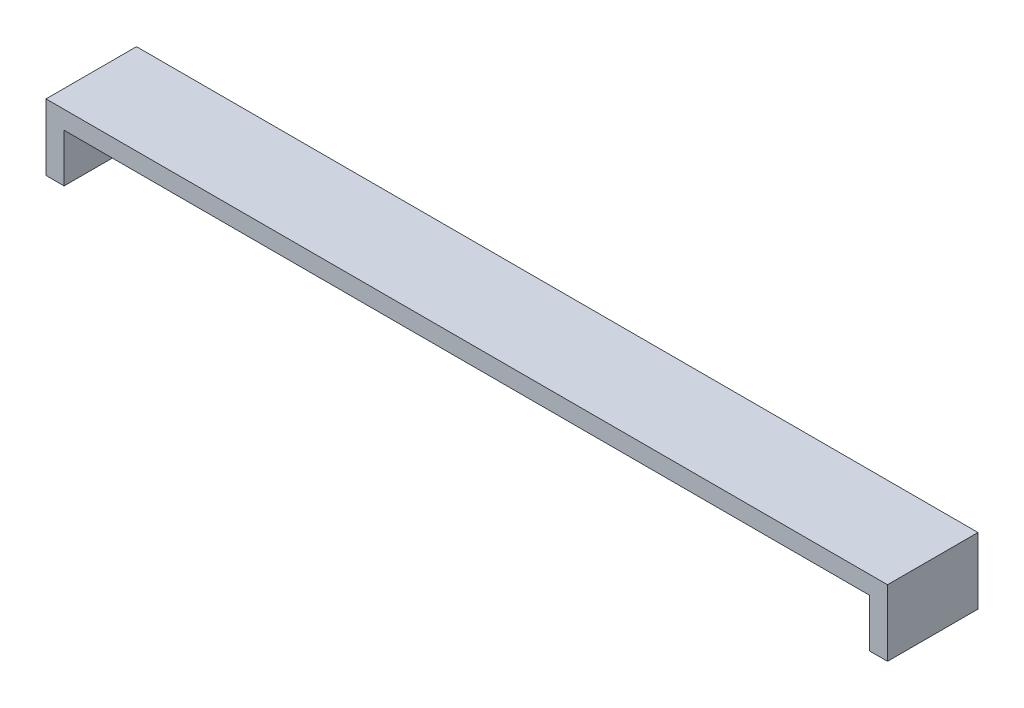
ISO-10303-21;
HEADER;
FILE_DESCRIPTION(('STEP AP214'),'2;1');
FILE_NAME('part.step','',(''),(''),'','','');
FILE_SCHEMA(('AUTOMOTIVE_DESIGN { 1 0 10303 214 1 1 1 1 }'));
ENDSEC;
DATA;
#1=APPLICATION_CONTEXT('core data for automotive mechanical design processes');
#2=APPLICATION_PROTOCOL_DEFINITION('international standard','automotive_design',2000,#1);
#3=PRODUCT_CONTEXT('',#1,'mechanical');
#4=PRODUCT('Part','Part','',(#3));
#5=PRODUCT_RELATED_PRODUCT_CATEGORY('part','',(#4));
#6=PRODUCT_DEFINITION_FORMATION('','',#4);
#7=PRODUCT_DEFINITION_CONTEXT('part definition',#1,'design');
#8=PRODUCT_DEFINITION('design','',#6,#7);
#9=PRODUCT_DEFINITION_SHAPE('','',#8);
#10=(LENGTH_UNIT() NAMED_UNIT(*) SI_UNIT(.MILLI.,.METRE.));
#11=(NAMED_UNIT(*) PLANE_ANGLE_UNIT() SI_UNIT($,.RADIAN.));
#12=(NAMED_UNIT(*) SI_UNIT($,.STERADIAN.) SOLID_ANGLE_UNIT());
#13=UNCERTAINTY_MEASURE_WITH_UNIT(LENGTH_MEASURE(1.E-05),#10,'distance_accuracy_value','');
#14=(GEOMETRIC_REPRESENTATION_CONTEXT(3) GLOBAL_UNCERTAINTY_ASSIGNED_CONTEXT((#13)) GLOBAL_UNIT_ASSIGNED_CONTEXT((#10,
#11,#12)) REPRESENTATION_CONTEXT('',''));
#15=CARTESIAN_POINT('',(0.,0.,0.));
#16=DIRECTION('',(0.,0.,1.));
#17=DIRECTION('',(1.,0.,0.));
#18=AXIS2_PLACEMENT_3D('',#15,#16,#17);
#19=CARTESIAN_POINT('',(69.75,-4.,15.));
#20=DIRECTION('',(0.,1.,0.));
#21=DIRECTION('',(-1.,0.,0.));
#22=AXIS2_PLACEMENT_3D('',#19,#20,#21);
#23=PLANE('',#22);
#24=DIRECTION('',(1.,0.,0.));
#25=VECTOR('',#24,1.);
#26=CARTESIAN_POINT('',(69.75,-4.,0.));
#27=LINE('',#26,#25);
#28=CARTESIAN_POINT('',(66.7499999999999,-4.,0.));
#29=VERTEX_POINT('',#28);
#30=CARTESIAN_POINT('',(69.75,-4.,0.));
#31=VERTEX_POINT('',#30);
#32=EDGE_CURVE('E129',#29,#31,#27,.T.);
#33=ORIENTED_EDGE('',*,*,#32,.T.);
#34=DIRECTION('',(0.,0.,-1.));
#35=VECTOR('',#34,1.);
#36=CARTESIAN_POINT('',(69.75,-4.,15.));
#37=LINE('',#36,#35);
#38=CARTESIAN_POINT('',(69.75,-4.,15.));
#39=VERTEX_POINT('',#38);
#40=EDGE_CURVE('E11',#39,#31,#37,.T.);
#41=ORIENTED_EDGE('',*,*,#40,.F.);
#42=DIRECTION('',(1.,0.,0.));
#43=VECTOR('',#42,1.);
#44=CARTESIAN_POINT('',(69.75,-4.,15.));
#45=LINE('',#44,#43);
#46=CARTESIAN_POINT('',(66.7499999999999,-4.,15.));
#47=VERTEX_POINT('',#46);
#48=EDGE_CURVE('E143',#47,#39,#45,.T.);
#49=ORIENTED_EDGE('',*,*,#48,.F.);
#50=DIRECTION('',(0.,0.,-1.));
#51=VECTOR('',#50,1.);
#52=CARTESIAN_POINT('',(66.7499999999999,-4.,15.));
#53=LINE('',#52,#51);
#54=EDGE_CURVE('E125',#47,#29,#53,.T.);
#55=ORIENTED_EDGE('',*,*,#54,.T.);
#56=EDGE_LOOP('',(#33,#41,#49,#55));
#57=FACE_BOUND('',#56,.T.);
#58=ADVANCED_FACE('F33',(#57),#23,.F.);
#59=CARTESIAN_POINT('',(69.7499999999999,7.,15.));
#60=DIRECTION('',(-1.,0.,0.));
#61=DIRECTION('',(0.,-1.,0.));
#62=AXIS2_PLACEMENT_3D('',#59,#60,#61);
#63=PLANE('',#62);
#64=DIRECTION('',(0.,1.,0.));
#65=VECTOR('',#64,1.);
#66=CARTESIAN_POINT('',(69.7499999999999,7.,0.));
#67=LINE('',#66,#65);
#68=CARTESIAN_POINT('',(69.7499999999999,7.,0.));
#69=VERTEX_POINT('',#68);
#70=EDGE_CURVE('E132',#31,#69,#67,.T.);
#71=ORIENTED_EDGE('',*,*,#70,.T.);
#72=DIRECTION('',(0.,0.,-1.));
#73=VECTOR('',#72,1.);
#74=CARTESIAN_POINT('',(69.7499999999999,7.,15.));
#75=LINE('',#74,#73);
#76=CARTESIAN_POINT('',(69.7499999999999,7.,15.));
#77=VERTEX_POINT('',#76);
#78=EDGE_CURVE('E41',#77,#69,#75,.T.);
#79=ORIENTED_EDGE('',*,*,#78,.F.);
#80=DIRECTION('',(0.,1.,0.));
#81=VECTOR('',#80,1.);
#82=CARTESIAN_POINT('',(69.7499999999999,7.,15.));
#83=LINE('',#82,#81);
#84=EDGE_CURVE('E92',#39,#77,#83,.T.);
#85=ORIENTED_EDGE('',*,*,#84,.F.);
#86=ORIENTED_EDGE('',*,*,#40,.T.);
#87=EDGE_LOOP('',(#71,#79,#85,#86));
#88=FACE_BOUND('',#87,.T.);
#89=ADVANCED_FACE('F178',(#88),#63,.F.);
#90=CARTESIAN_POINT('',(-69.7500000000001,7.,15.));
#91=DIRECTION('',(0.,-1.,0.));
#92=DIRECTION('',(0.,0.,-1.));
#93=AXIS2_PLACEMENT_3D('',#90,#91,#92);
#94=PLANE('',#93);
#95=DIRECTION('',(-1.,0.,0.));
#96=VECTOR('',#95,1.);
#97=CARTESIAN_POINT('',(-69.7500000000001,7.,0.));
#98=LINE('',#97,#96);
#99=CARTESIAN_POINT('',(-69.7500000000001,7.,0.));
#100=VERTEX_POINT('',#99);
#101=EDGE_CURVE('E134',#69,#100,#98,.T.);
#102=ORIENTED_EDGE('',*,*,#101,.T.);
#103=DIRECTION('',(0.,0.,-1.));
#104=VECTOR('',#103,1.);
#105=CARTESIAN_POINT('',(-69.7500000000001,7.,15.));
#106=LINE('',#105,#104);
#107=CARTESIAN_POINT('',(-69.7500000000001,7.,15.));
#108=VERTEX_POINT('',#107);
#109=EDGE_CURVE('E150',#108,#100,#106,.T.);
#110=ORIENTED_EDGE('',*,*,#109,.F.);
#111=DIRECTION('',(-1.,0.,0.));
#112=VECTOR('',#111,1.);
#113=CARTESIAN_POINT('',(-69.7500000000001,7.,15.));
#114=LINE('',#113,#112);
#115=EDGE_CURVE('E158',#77,#108,#114,.T.);
#116=ORIENTED_EDGE('',*,*,#115,.F.);
#117=ORIENTED_EDGE('',*,*,#78,.T.);
#118=EDGE_LOOP('',(#102,#110,#116,#117));
#119=FACE_BOUND('',#118,.T.);
#120=ADVANCED_FACE('F156',(#119),#94,.F.);
#121=CARTESIAN_POINT('',(-69.7500000000001,-4.,15.));
#122=DIRECTION('',(1.,0.,0.));
#123=DIRECTION('',(0.,0.,-1.));
#124=AXIS2_PLACEMENT_3D('',#121,#122,#123);
#125=PLANE('',#124);
#126=DIRECTION('',(0.,-1.,0.));
#127=VECTOR('',#126,1.);
#128=CARTESIAN_POINT('',(-69.7500000000001,-4.,0.));
#129=LINE('',#128,#127);
#130=CARTESIAN_POINT('',(-69.7500000000001,-4.,0.));
#131=VERTEX_POINT('',#130);
#132=EDGE_CURVE('E136',#100,#131,#129,.T.);
#133=ORIENTED_EDGE('',*,*,#132,.T.);
#134=DIRECTION('',(0.,0.,-1.));
#135=VECTOR('',#134,1.);
#136=CARTESIAN_POINT('',(-69.7500000000001,-4.,15.));
#137=LINE('',#136,#135);
#138=CARTESIAN_POINT('',(-69.7500000000001,-4.,15.));
#139=VERTEX_POINT('',#138);
#140=EDGE_CURVE('E147',#139,#131,#137,.T.);
#141=ORIENTED_EDGE('',*,*,#140,.F.);
#142=DIRECTION('',(0.,-1.,0.));
#143=VECTOR('',#142,1.);
#144=CARTESIAN_POINT('',(-69.7500000000001,-4.,15.));
#145=LINE('',#144,#143);
#146=EDGE_CURVE('E170',#108,#139,#145,.T.);
#147=ORIENTED_EDGE('',*,*,#146,.F.);
#148=ORIENTED_EDGE('',*,*,#109,.T.);
#149=EDGE_LOOP('',(#133,#141,#147,#148));
#150=FACE_BOUND('',#149,.T.);
#151=ADVANCED_FACE('F166',(#150),#125,.F.);
#152=CARTESIAN_POINT('',(-66.7500000000001,-4.,15.));
#153=DIRECTION('',(0.,1.,0.));
#154=DIRECTION('',(0.,0.,1.));
#155=AXIS2_PLACEMENT_3D('',#152,#153,#154);
#156=PLANE('',#155);
#157=DIRECTION('',(1.,0.,0.));
#158=VECTOR('',#157,1.);
#159=CARTESIAN_POINT('',(-66.7500000000001,-4.,0.));
#160=LINE('',#159,#158);
#161=CARTESIAN_POINT('',(-66.7500000000001,-4.,0.));
#162=VERTEX_POINT('',#161);
#163=EDGE_CURVE('E138',#131,#162,#160,.T.);
#164=ORIENTED_EDGE('',*,*,#163,.T.);
#165=DIRECTION('',(0.,0.,-1.));
#166=VECTOR('',#165,1.);
#167=CARTESIAN_POINT('',(-66.7500000000001,-4.,15.));
#168=LINE('',#167,#166);
#169=CARTESIAN_POINT('',(-66.7500000000001,-4.,15.));
#170=VERTEX_POINT('',#169);
#171=EDGE_CURVE('E120',#170,#162,#168,.T.);
#172=ORIENTED_EDGE('',*,*,#171,.F.);
#173=DIRECTION('',(1.,0.,0.));
#174=VECTOR('',#173,1.);
#175=CARTESIAN_POINT('',(-66.7500000000001,-4.,15.));
#176=LINE('',#175,#174);
#177=EDGE_CURVE('E111',#139,#170,#176,.T.);
#178=ORIENTED_EDGE('',*,*,#177,.F.);
#179=ORIENTED_EDGE('',*,*,#140,.T.);
#180=EDGE_LOOP('',(#164,#172,#178,#179));
#181=FACE_BOUND('',#180,.T.);
#182=ADVANCED_FACE('F169',(#181),#156,.F.);
#183=CARTESIAN_POINT('',(-66.7500000000001,4.,15.));
#184=DIRECTION('',(-1.,0.,0.));
#185=DIRECTION('',(0.,-1.,0.));
#186=AXIS2_PLACEMENT_3D('',#183,#184,#185);
#187=PLANE('',#186);
#188=DIRECTION('',(0.,1.,0.));
#189=VECTOR('',#188,1.);
#190=CARTESIAN_POINT('',(-66.7500000000001,4.,0.));
#191=LINE('',#190,#189);
#192=CARTESIAN_POINT('',(-66.7500000000001,4.,0.));
#193=VERTEX_POINT('',#192);
#194=EDGE_CURVE('E119',#162,#193,#191,.T.);
#195=ORIENTED_EDGE('',*,*,#194,.T.);
#196=DIRECTION('',(0.,0.,-1.));
#197=VECTOR('',#196,1.);
#198=CARTESIAN_POINT('',(-66.7500000000001,4.,15.));
#199=LINE('',#198,#197);
#200=CARTESIAN_POINT('',(-66.7500000000001,4.,15.));
#201=VERTEX_POINT('',#200);
#202=EDGE_CURVE('E116',#201,#193,#199,.T.);
#203=ORIENTED_EDGE('',*,*,#202,.F.);
#204=DIRECTION('',(0.,1.,0.));
#205=VECTOR('',#204,1.);
#206=CARTESIAN_POINT('',(-66.7500000000001,4.,15.));
#207=LINE('',#206,#205);
#208=EDGE_CURVE('E105',#170,#201,#207,.T.);
#209=ORIENTED_EDGE('',*,*,#208,.F.);
#210=ORIENTED_EDGE('',*,*,#171,.T.);
#211=EDGE_LOOP('',(#195,#203,#209,#210));
#212=FACE_BOUND('',#211,.T.);
#213=ADVANCED_FACE('F117',(#212),#187,.F.);
#214=CARTESIAN_POINT('',(-66.7500000000001,4.,15.));
#215=DIRECTION('',(0.,1.,0.));
#216=DIRECTION('',(0.,0.,1.));
#217=AXIS2_PLACEMENT_3D('',#214,#215,#216);
#218=PLANE('',#217);
#219=DIRECTION('',(1.,0.,0.));
#220=VECTOR('',#219,1.);
#221=CARTESIAN_POINT('',(-66.7500000000001,4.,0.));
#222=LINE('',#221,#220);
#223=CARTESIAN_POINT('',(66.7499999999999,4.,0.));
#224=VERTEX_POINT('',#223);
#225=EDGE_CURVE('E78',#193,#224,#222,.T.);
#226=ORIENTED_EDGE('',*,*,#225,.T.);
#227=DIRECTION('',(0.,0.,-1.));
#228=VECTOR('',#227,1.);
#229=CARTESIAN_POINT('',(66.7499999999999,4.,15.));
#230=LINE('',#229,#228);
#231=CARTESIAN_POINT('',(66.7499999999999,4.,15.));
#232=VERTEX_POINT('',#231);
#233=EDGE_CURVE('E121',#232,#224,#230,.T.);
#234=ORIENTED_EDGE('',*,*,#233,.F.);
#235=DIRECTION('',(1.,0.,0.));
#236=VECTOR('',#235,1.);
#237=CARTESIAN_POINT('',(-66.7500000000001,4.,15.));
#238=LINE('',#237,#236);
#239=EDGE_CURVE('E109',#201,#232,#238,.T.);
#240=ORIENTED_EDGE('',*,*,#239,.F.);
#241=ORIENTED_EDGE('',*,*,#202,.T.);
#242=EDGE_LOOP('',(#226,#234,#240,#241));
#243=FACE_BOUND('',#242,.T.);
#244=ADVANCED_FACE('F123',(#243),#218,.F.);
#245=CARTESIAN_POINT('',(66.7499999999999,4.,15.));
#246=DIRECTION('',(1.,0.,0.));
#247=DIRECTION('',(0.,1.,0.));
#248=AXIS2_PLACEMENT_3D('',#245,#246,#247);
#249=PLANE('',#248);
#250=DIRECTION('',(0.,-1.,0.));
#251=VECTOR('',#250,1.);
#252=CARTESIAN_POINT('',(66.7499999999999,4.,0.));
#253=LINE('',#252,#251);
#254=EDGE_CURVE('E84',#224,#29,#253,.T.);
#255=ORIENTED_EDGE('',*,*,#254,.T.);
#256=ORIENTED_EDGE('',*,*,#54,.F.);
#257=DIRECTION('',(0.,-1.,0.));
#258=VECTOR('',#257,1.);
#259=CARTESIAN_POINT('',(66.7499999999999,4.,15.));
#260=LINE('',#259,#258);
#261=EDGE_CURVE('E49',#232,#47,#260,.T.);
#262=ORIENTED_EDGE('',*,*,#261,.F.);
#263=ORIENTED_EDGE('',*,*,#233,.T.);
#264=EDGE_LOOP('',(#255,#256,#262,#263));
#265=FACE_BOUND('',#264,.T.);
#266=ADVANCED_FACE('F194',(#265),#249,.F.);
#267=CARTESIAN_POINT('',(0.,0.,15.));
#268=DIRECTION('',(0.,0.,1.));
#269=DIRECTION('',(1.,0.,0.));
#270=AXIS2_PLACEMENT_3D('',#267,#268,#269);
#271=PLANE('',#270);
#272=ORIENTED_EDGE('',*,*,#48,.T.);
#273=ORIENTED_EDGE('',*,*,#84,.T.);
#274=ORIENTED_EDGE('',*,*,#115,.T.);
#275=ORIENTED_EDGE('',*,*,#146,.T.);
#276=ORIENTED_EDGE('',*,*,#177,.T.);
#277=ORIENTED_EDGE('',*,*,#208,.T.);
#278=ORIENTED_EDGE('',*,*,#239,.T.);
#279=ORIENTED_EDGE('',*,*,#261,.T.);
#280=EDGE_LOOP('',(#272,#273,#274,#275,#276,#277,#278,#279));
#281=FACE_BOUND('',#280,.T.);
#282=ADVANCED_FACE('F107',(#281),#271,.T.);
#283=CARTESIAN_POINT('',(0.,0.,0.));
#284=DIRECTION('',(0.,0.,1.));
#285=DIRECTION('',(1.,0.,0.));
#286=AXIS2_PLACEMENT_3D('',#283,#284,#285);
#287=PLANE('',#286);
#288=ORIENTED_EDGE('',*,*,#32,.F.);
#289=ORIENTED_EDGE('',*,*,#254,.F.);
#290=ORIENTED_EDGE('',*,*,#225,.F.);
#291=ORIENTED_EDGE('',*,*,#194,.F.);
#292=ORIENTED_EDGE('',*,*,#163,.F.);
#293=ORIENTED_EDGE('',*,*,#132,.F.);
#294=ORIENTED_EDGE('',*,*,#101,.F.);
#295=ORIENTED_EDGE('',*,*,#70,.F.);
#296=EDGE_LOOP('',(#288,#289,#290,#291,#292,#293,#294,#295));
#297=FACE_BOUND('',#296,.T.);
#298=ADVANCED_FACE('F162',(#297),#287,.F.);
#299=CLOSED_SHELL('',(#58,#89,#120,#151,#182,#213,#244,#266,#282,#298));
#300=MANIFOLD_SOLID_BREP('B2',#299);
#301=ADVANCED_BREP_SHAPE_REPRESENTATION('',(#18,#300),#14);
#302=SHAPE_DEFINITION_REPRESENTATION(#9,#301);
ENDSEC;
END-ISO-10303-21;
